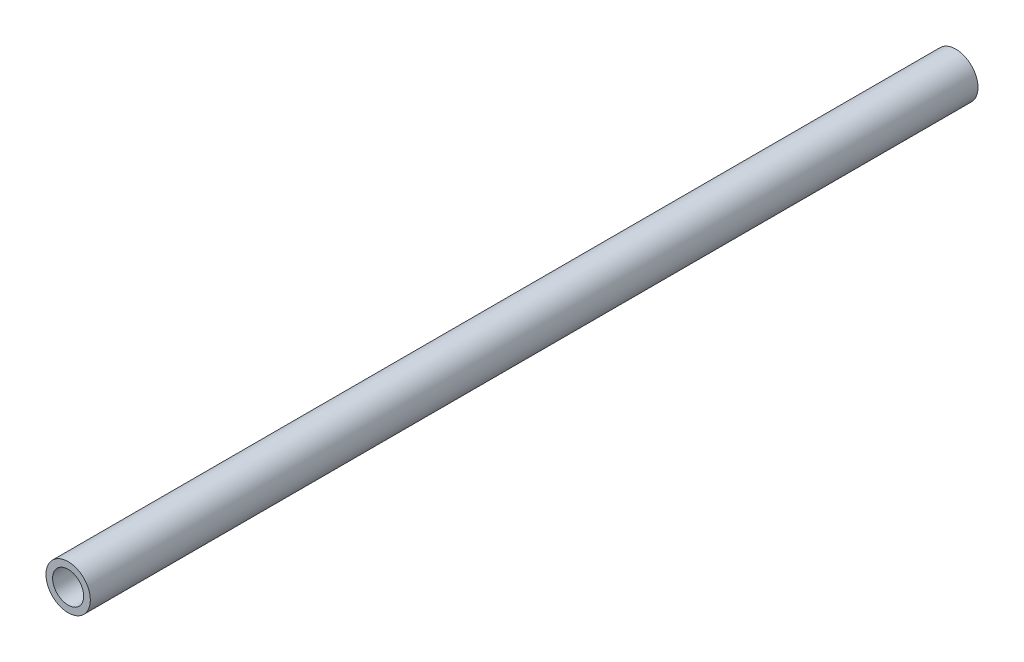
ISO-10303-21;
HEADER;
FILE_DESCRIPTION(('STEP AP214'),'2;1');
FILE_NAME('part.step','',(''),(''),'','','');
FILE_SCHEMA(('AUTOMOTIVE_DESIGN { 1 0 10303 214 1 1 1 1 }'));
ENDSEC;
DATA;
#1=APPLICATION_CONTEXT('core data for automotive mechanical design processes');
#2=APPLICATION_PROTOCOL_DEFINITION('international standard','automotive_design',2000,#1);
#3=PRODUCT_CONTEXT('',#1,'mechanical');
#4=PRODUCT('Part','Part','',(#3));
#5=PRODUCT_RELATED_PRODUCT_CATEGORY('part','',(#4));
#6=PRODUCT_DEFINITION_FORMATION('','',#4);
#7=PRODUCT_DEFINITION_CONTEXT('part definition',#1,'design');
#8=PRODUCT_DEFINITION('design','',#6,#7);
#9=PRODUCT_DEFINITION_SHAPE('','',#8);
#10=(LENGTH_UNIT() NAMED_UNIT(*) SI_UNIT(.MILLI.,.METRE.));
#11=(NAMED_UNIT(*) PLANE_ANGLE_UNIT() SI_UNIT($,.RADIAN.));
#12=(NAMED_UNIT(*) SI_UNIT($,.STERADIAN.) SOLID_ANGLE_UNIT());
#13=UNCERTAINTY_MEASURE_WITH_UNIT(LENGTH_MEASURE(1.E-05),#10,'distance_accuracy_value','');
#14=(GEOMETRIC_REPRESENTATION_CONTEXT(3) GLOBAL_UNCERTAINTY_ASSIGNED_CONTEXT((#13)) GLOBAL_UNIT_ASSIGNED_CONTEXT((#10,
#11,#12)) REPRESENTATION_CONTEXT('',''));
#15=CARTESIAN_POINT('',(0.,0.,0.));
#16=DIRECTION('',(0.,0.,1.));
#17=DIRECTION('',(1.,0.,0.));
#18=AXIS2_PLACEMENT_3D('',#15,#16,#17);
#19=CARTESIAN_POINT('',(0.,0.,200.));
#20=DIRECTION('',(0.,0.,1.));
#21=DIRECTION('',(1.,0.,0.));
#22=AXIS2_PLACEMENT_3D('',#19,#20,#21);
#23=PLANE('',#22);
#24=CARTESIAN_POINT('',(0.,0.,200.));
#25=DIRECTION('',(0.,0.,1.));
#26=DIRECTION('',(1.,0.,0.));
#27=AXIS2_PLACEMENT_3D('',#24,#25,#26);
#28=CIRCLE('',#27,5.);
#29=CARTESIAN_POINT('',(5.,0.,200.));
#30=VERTEX_POINT('',#29);
#31=EDGE_CURVE('E10',#30,#30,#28,.T.);
#32=ORIENTED_EDGE('',*,*,#31,.T.);
#33=EDGE_LOOP('',(#32));
#34=FACE_BOUND('',#33,.T.);
#35=CARTESIAN_POINT('',(0.,0.,200.));
#36=DIRECTION('',(0.,0.,1.));
#37=DIRECTION('',(1.,0.,0.));
#38=AXIS2_PLACEMENT_3D('',#35,#36,#37);
#39=CIRCLE('',#38,3.5);
#40=CARTESIAN_POINT('',(3.5,0.,200.));
#41=VERTEX_POINT('',#40);
#42=EDGE_CURVE('E54',#41,#41,#39,.T.);
#43=ORIENTED_EDGE('',*,*,#42,.F.);
#44=EDGE_LOOP('',(#43));
#45=FACE_BOUND('',#44,.T.);
#46=ADVANCED_FACE('F41',(#34,#45),#23,.T.);
#47=CARTESIAN_POINT('',(0.,0.,0.));
#48=DIRECTION('',(0.,0.,1.));
#49=DIRECTION('',(1.,0.,0.));
#50=AXIS2_PLACEMENT_3D('',#47,#48,#49);
#51=PLANE('',#50);
#52=CARTESIAN_POINT('',(0.,0.,0.));
#53=DIRECTION('',(0.,0.,1.));
#54=DIRECTION('',(1.,0.,0.));
#55=AXIS2_PLACEMENT_3D('',#52,#53,#54);
#56=CIRCLE('',#55,5.);
#57=CARTESIAN_POINT('',(5.,0.,0.));
#58=VERTEX_POINT('',#57);
#59=EDGE_CURVE('E45',#58,#58,#56,.T.);
#60=ORIENTED_EDGE('',*,*,#59,.F.);
#61=EDGE_LOOP('',(#60));
#62=FACE_BOUND('',#61,.T.);
#63=CARTESIAN_POINT('',(0.,0.,0.));
#64=DIRECTION('',(0.,0.,1.));
#65=DIRECTION('',(1.,0.,0.));
#66=AXIS2_PLACEMENT_3D('',#63,#64,#65);
#67=CIRCLE('',#66,3.5);
#68=CARTESIAN_POINT('',(3.5,0.,0.));
#69=VERTEX_POINT('',#68);
#70=EDGE_CURVE('E56',#69,#69,#67,.T.);
#71=ORIENTED_EDGE('',*,*,#70,.T.);
#72=EDGE_LOOP('',(#71));
#73=FACE_BOUND('',#72,.T.);
#74=ADVANCED_FACE('F68',(#62,#73),#51,.F.);
#75=CARTESIAN_POINT('',(0.,0.,200.));
#76=DIRECTION('',(0.,0.,-1.));
#77=DIRECTION('',(-1.,0.,0.));
#78=AXIS2_PLACEMENT_3D('',#75,#76,#77);
#79=CYLINDRICAL_SURFACE('',#78,5.);
#80=ORIENTED_EDGE('',*,*,#31,.F.);
#81=EDGE_LOOP('',(#80));
#82=FACE_BOUND('',#81,.T.);
#83=ORIENTED_EDGE('',*,*,#59,.T.);
#84=EDGE_LOOP('',(#83));
#85=FACE_BOUND('',#84,.T.);
#86=ADVANCED_FACE('F43',(#82,#85),#79,.T.);
#87=CARTESIAN_POINT('',(0.,0.,200.));
#88=DIRECTION('',(0.,0.,-1.));
#89=DIRECTION('',(-1.,0.,0.));
#90=AXIS2_PLACEMENT_3D('',#87,#88,#89);
#91=CYLINDRICAL_SURFACE('',#90,3.5);
#92=ORIENTED_EDGE('',*,*,#42,.T.);
#93=EDGE_LOOP('',(#92));
#94=FACE_BOUND('',#93,.T.);
#95=ORIENTED_EDGE('',*,*,#70,.F.);
#96=EDGE_LOOP('',(#95));
#97=FACE_BOUND('',#96,.T.);
#98=ADVANCED_FACE('F64',(#94,#97),#91,.F.);
#99=CLOSED_SHELL('',(#46,#74,#86,#98));
#100=MANIFOLD_SOLID_BREP('B2',#99);
#101=ADVANCED_BREP_SHAPE_REPRESENTATION('',(#18,#100),#14);
#102=SHAPE_DEFINITION_REPRESENTATION(#9,#101);
ENDSEC;
END-ISO-10303-21;
